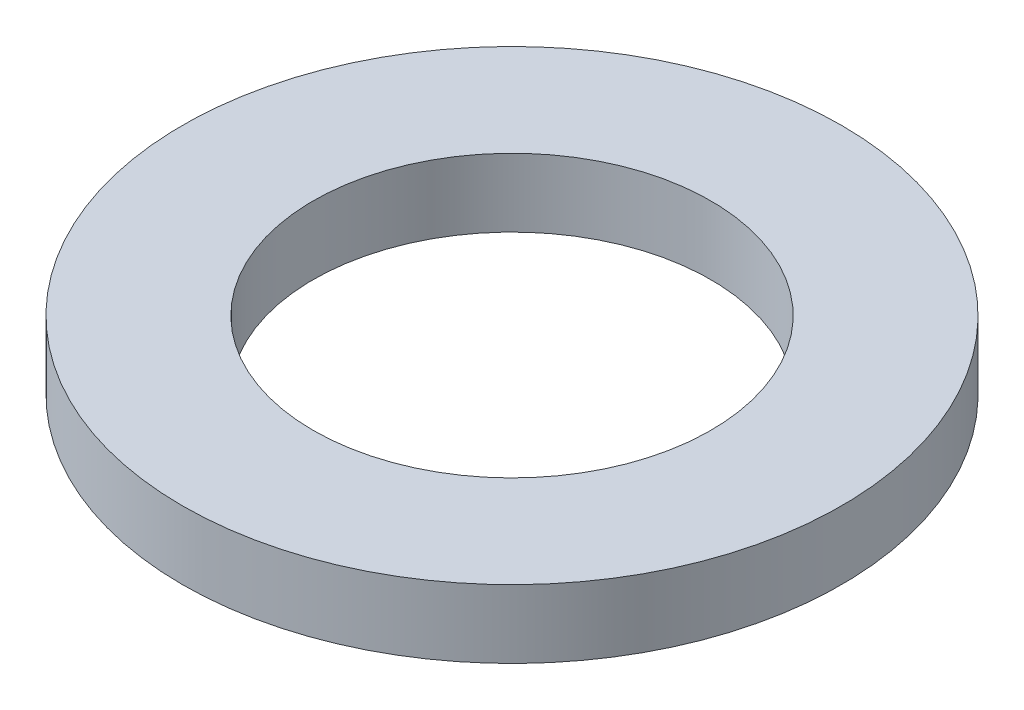
ISO-10303-21;
HEADER;
FILE_DESCRIPTION(('STEP AP214'),'2;1');
FILE_NAME('part.step','',(''),(''),'','','');
FILE_SCHEMA(('AUTOMOTIVE_DESIGN { 1 0 10303 214 1 1 1 1 }'));
ENDSEC;
DATA;
#1=APPLICATION_CONTEXT('core data for automotive mechanical design processes');
#2=APPLICATION_PROTOCOL_DEFINITION('international standard','automotive_design',2000,#1);
#3=PRODUCT_CONTEXT('',#1,'mechanical');
#4=PRODUCT('Part','Part','',(#3));
#5=PRODUCT_RELATED_PRODUCT_CATEGORY('part','',(#4));
#6=PRODUCT_DEFINITION_FORMATION('','',#4);
#7=PRODUCT_DEFINITION_CONTEXT('part definition',#1,'design');
#8=PRODUCT_DEFINITION('design','',#6,#7);
#9=PRODUCT_DEFINITION_SHAPE('','',#8);
#10=(LENGTH_UNIT() NAMED_UNIT(*) SI_UNIT(.MILLI.,.METRE.));
#11=(NAMED_UNIT(*) PLANE_ANGLE_UNIT() SI_UNIT($,.RADIAN.));
#12=(NAMED_UNIT(*) SI_UNIT($,.STERADIAN.) SOLID_ANGLE_UNIT());
#13=UNCERTAINTY_MEASURE_WITH_UNIT(LENGTH_MEASURE(1.E-05),#10,'distance_accuracy_value','');
#14=(GEOMETRIC_REPRESENTATION_CONTEXT(3) GLOBAL_UNCERTAINTY_ASSIGNED_CONTEXT((#13)) GLOBAL_UNIT_ASSIGNED_CONTEXT((#10,
#11,#12)) REPRESENTATION_CONTEXT('',''));
#15=CARTESIAN_POINT('',(0.,0.,0.));
#16=DIRECTION('',(0.,0.,1.));
#17=DIRECTION('',(1.,0.,0.));
#18=AXIS2_PLACEMENT_3D('',#15,#16,#17);
#19=CARTESIAN_POINT('',(0.,2.,0.));
#20=DIRECTION('',(0.,1.,0.));
#21=DIRECTION('',(0.,0.,1.));
#22=AXIS2_PLACEMENT_3D('',#19,#20,#21);
#23=PLANE('',#22);
#24=CARTESIAN_POINT('',(0.,2.,0.));
#25=DIRECTION('',(0.,1.,0.));
#26=DIRECTION('',(0.,0.,1.));
#27=AXIS2_PLACEMENT_3D('',#24,#25,#26);
#28=CIRCLE('',#27,9.655);
#29=CARTESIAN_POINT('',(0.,2.,9.655));
#30=VERTEX_POINT('',#29);
#31=EDGE_CURVE('E13',#30,#30,#28,.T.);
#32=ORIENTED_EDGE('',*,*,#31,.T.);
#33=EDGE_LOOP('',(#32));
#34=FACE_BOUND('',#33,.T.);
#35=CARTESIAN_POINT('',(0.,2.,0.));
#36=DIRECTION('',(0.,1.,0.));
#37=DIRECTION('',(0.,0.,1.));
#38=AXIS2_PLACEMENT_3D('',#35,#36,#37);
#39=CIRCLE('',#38,5.825);
#40=CARTESIAN_POINT('',(0.,2.,5.825));
#41=VERTEX_POINT('',#40);
#42=EDGE_CURVE('E59',#41,#41,#39,.T.);
#43=ORIENTED_EDGE('',*,*,#42,.F.);
#44=EDGE_LOOP('',(#43));
#45=FACE_BOUND('',#44,.T.);
#46=ADVANCED_FACE('F48',(#34,#45),#23,.T.);
#47=CARTESIAN_POINT('',(0.,0.,0.));
#48=DIRECTION('',(0.,1.,0.));
#49=DIRECTION('',(0.,0.,1.));
#50=AXIS2_PLACEMENT_3D('',#47,#48,#49);
#51=PLANE('',#50);
#52=CARTESIAN_POINT('',(0.,0.,0.));
#53=DIRECTION('',(0.,1.,0.));
#54=DIRECTION('',(0.,0.,1.));
#55=AXIS2_PLACEMENT_3D('',#52,#53,#54);
#56=CIRCLE('',#55,9.655);
#57=CARTESIAN_POINT('',(0.,0.,9.655));
#58=VERTEX_POINT('',#57);
#59=EDGE_CURVE('E52',#58,#58,#56,.T.);
#60=ORIENTED_EDGE('',*,*,#59,.F.);
#61=EDGE_LOOP('',(#60));
#62=FACE_BOUND('',#61,.T.);
#63=CARTESIAN_POINT('',(0.,0.,0.));
#64=DIRECTION('',(0.,1.,0.));
#65=DIRECTION('',(0.,0.,1.));
#66=AXIS2_PLACEMENT_3D('',#63,#64,#65);
#67=CIRCLE('',#66,5.825);
#68=CARTESIAN_POINT('',(0.,0.,5.825));
#69=VERTEX_POINT('',#68);
#70=EDGE_CURVE('E61',#69,#69,#67,.T.);
#71=ORIENTED_EDGE('',*,*,#70,.T.);
#72=EDGE_LOOP('',(#71));
#73=FACE_BOUND('',#72,.T.);
#74=ADVANCED_FACE('F71',(#62,#73),#51,.F.);
#75=CARTESIAN_POINT('',(0.,2.,0.));
#76=DIRECTION('',(0.,-1.,0.));
#77=DIRECTION('',(0.,0.,-1.));
#78=AXIS2_PLACEMENT_3D('',#75,#76,#77);
#79=CYLINDRICAL_SURFACE('',#78,9.655);
#80=ORIENTED_EDGE('',*,*,#31,.F.);
#81=EDGE_LOOP('',(#80));
#82=FACE_BOUND('',#81,.T.);
#83=ORIENTED_EDGE('',*,*,#59,.T.);
#84=EDGE_LOOP('',(#83));
#85=FACE_BOUND('',#84,.T.);
#86=ADVANCED_FACE('F50',(#82,#85),#79,.T.);
#87=CARTESIAN_POINT('',(0.,2.,0.));
#88=DIRECTION('',(0.,-1.,0.));
#89=DIRECTION('',(0.,0.,-1.));
#90=AXIS2_PLACEMENT_3D('',#87,#88,#89);
#91=CYLINDRICAL_SURFACE('',#90,5.825);
#92=ORIENTED_EDGE('',*,*,#42,.T.);
#93=EDGE_LOOP('',(#92));
#94=FACE_BOUND('',#93,.T.);
#95=ORIENTED_EDGE('',*,*,#70,.F.);
#96=EDGE_LOOP('',(#95));
#97=FACE_BOUND('',#96,.T.);
#98=ADVANCED_FACE('F67',(#94,#97),#91,.F.);
#99=CLOSED_SHELL('',(#46,#74,#86,#98));
#100=MANIFOLD_SOLID_BREP('B2',#99);
#101=ADVANCED_BREP_SHAPE_REPRESENTATION('',(#18,#100),#14);
#102=SHAPE_DEFINITION_REPRESENTATION(#9,#101);
ENDSEC;
END-ISO-10303-21;
